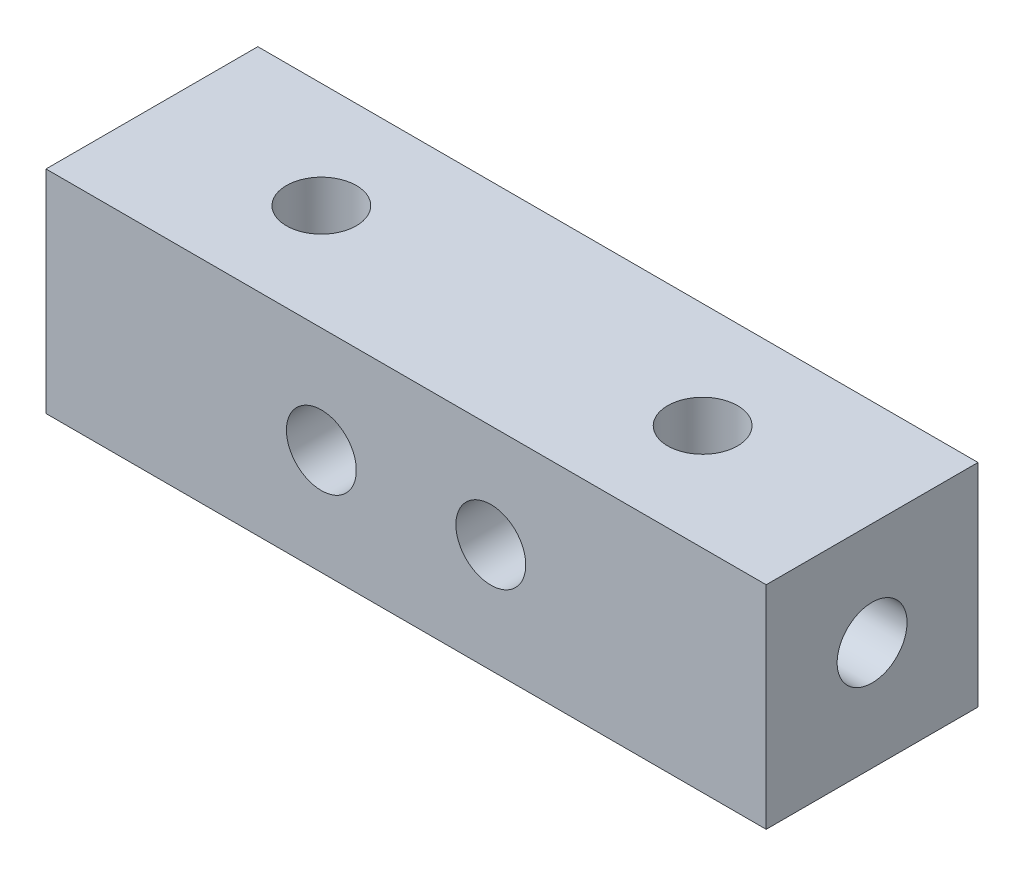
ISO-10303-21;
HEADER;
FILE_DESCRIPTION(('STEP AP214'),'2;1');
FILE_NAME('part.step','',(''),(''),'','','');
FILE_SCHEMA(('AUTOMOTIVE_DESIGN { 1 0 10303 214 1 1 1 1 }'));
ENDSEC;
DATA;
#1=APPLICATION_CONTEXT('core data for automotive mechanical design processes');
#2=APPLICATION_PROTOCOL_DEFINITION('international standard','automotive_design',2000,#1);
#3=PRODUCT_CONTEXT('',#1,'mechanical');
#4=PRODUCT('Part','Part','',(#3));
#5=PRODUCT_RELATED_PRODUCT_CATEGORY('part','',(#4));
#6=PRODUCT_DEFINITION_FORMATION('','',#4);
#7=PRODUCT_DEFINITION_CONTEXT('part definition',#1,'design');
#8=PRODUCT_DEFINITION('design','',#6,#7);
#9=PRODUCT_DEFINITION_SHAPE('','',#8);
#10=(LENGTH_UNIT() NAMED_UNIT(*) SI_UNIT(.MILLI.,.METRE.));
#11=(NAMED_UNIT(*) PLANE_ANGLE_UNIT() SI_UNIT($,.RADIAN.));
#12=(NAMED_UNIT(*) SI_UNIT($,.STERADIAN.) SOLID_ANGLE_UNIT());
#13=UNCERTAINTY_MEASURE_WITH_UNIT(LENGTH_MEASURE(1.E-05),#10,'distance_accuracy_value','');
#14=(GEOMETRIC_REPRESENTATION_CONTEXT(3) GLOBAL_UNCERTAINTY_ASSIGNED_CONTEXT((#13)) GLOBAL_UNIT_ASSIGNED_CONTEXT((#10,
#11,#12)) REPRESENTATION_CONTEXT('',''));
#15=CARTESIAN_POINT('',(0.,0.,0.));
#16=DIRECTION('',(0.,0.,1.));
#17=DIRECTION('',(1.,0.,0.));
#18=AXIS2_PLACEMENT_3D('',#15,#16,#17);
#19=CARTESIAN_POINT('',(17.,0.134296894459711,5.));
#20=DIRECTION('',(1.,0.,0.));
#21=DIRECTION('',(0.,0.,-1.));
#22=AXIS2_PLACEMENT_3D('',#19,#20,#21);
#23=CYLINDRICAL_SURFACE('',#22,1.65);
#24=CARTESIAN_POINT('',(9.00000000000001,0.134296894459711,5.));
#25=DIRECTION('',(0.707106781186547,0.707106781186547,0.));
#26=DIRECTION('',(0.707106781186547,-0.707106781186547,0.));
#27=AXIS2_PLACEMENT_3D('',#24,#25,#26);
#28=ELLIPSE('',#27,2.3334523779156,1.65);
#29=CARTESIAN_POINT('',(9.00000000000001,0.134296894459711,3.35));
#30=VERTEX_POINT('',#29);
#31=CARTESIAN_POINT('',(9.00000000000001,0.134296894459711,6.65));
#32=VERTEX_POINT('',#31);
#33=EDGE_CURVE('E141',#30,#32,#28,.T.);
#34=ORIENTED_EDGE('',*,*,#33,.T.);
#35=CARTESIAN_POINT('',(9.00000000000001,0.134296894459711,5.));
#36=DIRECTION('',(0.707106781186547,-0.707106781186547,0.));
#37=DIRECTION('',(0.707106781186547,0.707106781186547,0.));
#38=AXIS2_PLACEMENT_3D('',#35,#36,#37);
#39=ELLIPSE('',#38,2.3334523779156,1.65);
#40=EDGE_CURVE('E137',#32,#30,#39,.T.);
#41=ORIENTED_EDGE('',*,*,#40,.T.);
#42=EDGE_LOOP('',(#34,#41));
#43=FACE_BOUND('',#42,.T.);
#44=CARTESIAN_POINT('',(4.00000000000001,0.134296894459711,5.));
#45=DIRECTION('',(0.707106781186547,0.,0.707106781186547));
#46=DIRECTION('',(0.707106781186547,0.,-0.707106781186547));
#47=AXIS2_PLACEMENT_3D('',#44,#45,#46);
#48=ELLIPSE('',#47,2.3334523779156,1.65);
#49=CARTESIAN_POINT('',(4.00000000000001,1.78429689445971,5.));
#50=VERTEX_POINT('',#49);
#51=CARTESIAN_POINT('',(4.00000000000001,-1.51570310554028,5.));
#52=VERTEX_POINT('',#51);
#53=EDGE_CURVE('E59',#50,#52,#48,.F.);
#54=ORIENTED_EDGE('',*,*,#53,.T.);
#55=CARTESIAN_POINT('',(4.00000000000001,0.134296894459711,5.));
#56=DIRECTION('',(0.707106781186547,0.,-0.707106781186547));
#57=DIRECTION('',(0.707106781186547,0.,0.707106781186547));
#58=AXIS2_PLACEMENT_3D('',#55,#56,#57);
#59=ELLIPSE('',#58,2.3334523779156,1.65);
#60=EDGE_CURVE('E11',#52,#50,#59,.F.);
#61=ORIENTED_EDGE('',*,*,#60,.T.);
#62=EDGE_LOOP('',(#54,#61));
#63=FACE_BOUND('',#62,.T.);
#64=ADVANCED_FACE('F39',(#43,#63),#23,.F.);
#65=CARTESIAN_POINT('',(-5.64452556810116,0.134296894459711,3.35));
#66=CARTESIAN_POINT('',(-5.63838128300635,0.209553474713581,3.34999839990917));
#67=CARTESIAN_POINT('',(-5.62702957784832,0.284372493221433,3.35518794266545));
#68=CARTESIAN_POINT('',(-5.59460120311398,0.430536678441772,3.37513277728456));
#69=CARTESIAN_POINT('',(-5.5735182137332,0.501879554298802,3.38989428801288));
#70=CARTESIAN_POINT('',(-5.52312352893578,0.638651061992044,3.42738261235203));
#71=CARTESIAN_POINT('',(-5.49387376549181,0.704119487090391,3.45004978453406));
#72=CARTESIAN_POINT('',(-5.42850885262907,0.828747055599395,3.50173526103803));
#73=CARTESIAN_POINT('',(-5.39239191974611,0.887904553762668,3.53075521553024));
#74=CARTESIAN_POINT('',(-5.29743525106251,1.02409075553561,3.60742303689221));
#75=CARTESIAN_POINT('',(-5.23558230347391,1.09755793615206,3.65765457734761));
#76=CARTESIAN_POINT('',(-5.10283292496818,1.23092106916839,3.76419241031876));
#77=CARTESIAN_POINT('',(-5.03190859567463,1.29077350245006,3.82051735660913));
#78=CARTESIAN_POINT('',(-4.91877532240075,1.37133762860629,3.90736552748521));
#79=CARTESIAN_POINT('',(-4.8793597257372,1.39693624427059,3.93712683386715));
#80=CARTESIAN_POINT('',(-4.79847196497791,1.44469723292218,3.9966043625967));
#81=CARTESIAN_POINT('',(-4.75700045019747,1.46686068181839,4.02632059616213));
#82=CARTESIAN_POINT('',(-4.67193548442259,1.50772199471158,4.08486386236684));
#83=CARTESIAN_POINT('',(-4.62834684240008,1.52642728795923,4.11369268764112));
#84=CARTESIAN_POINT('',(-4.53864717746282,1.56033881216091,4.16936094289374));
#85=CARTESIAN_POINT('',(-4.4925391481768,1.57554908872966,4.19620264838331));
#86=CARTESIAN_POINT('',(-4.40436482139189,1.60023717474802,4.24230781753186));
#87=CARTESIAN_POINT('',(-4.36272870306332,1.61023250438028,4.26210412687908));
#88=CARTESIAN_POINT('',(-4.27695912181704,1.62717379178881,4.29700992796053));
#89=CARTESIAN_POINT('',(-4.23283204164422,1.63412717644369,4.31213080791551));
#90=CARTESIAN_POINT('',(-4.15035325607242,1.64356058762355,4.33311575664475));
#91=CARTESIAN_POINT('',(-4.11237906559687,1.64661804229242,4.34015131925974));
#92=CARTESIAN_POINT('',(-4.03569281320329,1.65005827436296,4.34808795746453));
#93=CARTESIAN_POINT('',(-3.99698201529201,1.65044528059273,4.34899873199483));
#94=CARTESIAN_POINT('',(-3.92006558964655,1.64851196302458,4.34451845579971));
#95=CARTESIAN_POINT('',(-3.88185942253961,1.64619481485897,4.33913479694843));
#96=CARTESIAN_POINT('',(-3.80678451789979,1.63908408186769,4.3231017881193));
#97=CARTESIAN_POINT('',(-3.76991901723732,1.63428488088951,4.31244049877558));
#98=CARTESIAN_POINT('',(-3.66907801012524,1.61781285217721,4.27730734099554));
#99=CARTESIAN_POINT('',(-3.60701927039166,1.6037128861853,4.24861134078378));
#100=CARTESIAN_POINT('',(-3.48757387903519,1.5696510415011,4.18540315060673));
#101=CARTESIAN_POINT('',(-3.43021184470437,1.54966052445117,4.15086290516764));
#102=CARTESIAN_POINT('',(-3.32418028987336,1.50623402718068,4.08251112350735));
#103=CARTESIAN_POINT('',(-3.27519014535316,1.48325657687882,4.0489033421607));
#104=CARTESIAN_POINT('',(-3.17998167989329,1.43282056765519,3.98111394426638));
#105=CARTESIAN_POINT('',(-3.13376534458885,1.40535884977585,3.94693193854404));
#106=CARTESIAN_POINT('',(-2.99922462644754,1.31625133939136,3.84519444198198));
#107=CARTESIAN_POINT('',(-2.91473241498692,1.24776965529226,3.77825555130815));
#108=CARTESIAN_POINT('',(-2.77960282747732,1.11334180103733,3.66986171366523));
#109=CARTESIAN_POINT('',(-2.72604376105199,1.05187357510263,3.62645973727763));
#110=CARTESIAN_POINT('',(-2.62701505302036,0.918837572531929,3.54638681988258));
#111=CARTESIAN_POINT('',(-2.58153182037528,0.847287134695607,3.50970456670675));
#112=CARTESIAN_POINT('',(-2.50885242335218,0.709770039813901,3.45218293732419));
#113=CARTESIAN_POINT('',(-2.47981868333233,0.645492209791653,3.42964538775561));
#114=CARTESIAN_POINT('',(-2.42974676037366,0.511752045929932,3.39225764047448));
#115=CARTESIAN_POINT('',(-2.408703779336,0.442292853346633,3.37740282767088));
#116=CARTESIAN_POINT('',(-2.37572927423904,0.299414205417291,3.35668780806618));
#117=CARTESIAN_POINT('',(-2.36385767262649,0.225972005295769,3.35088650674522));
#118=CARTESIAN_POINT('',(-2.35017674999692,0.0780513983567246,3.34930368810144));
#119=CARTESIAN_POINT('',(-2.34836338701865,0.00357341983678422,3.3535181449157));
#120=CARTESIAN_POINT('',(-2.35428229505021,-0.135906373600642,3.37091837065592));
#121=CARTESIAN_POINT('',(-2.36102958210719,-0.201080253765159,3.38311279961239));
#122=CARTESIAN_POINT('',(-2.38172513851613,-0.328403637483027,3.4148453491315));
#123=CARTESIAN_POINT('',(-2.39567466499334,-0.390552610976694,3.43438475157116));
#124=CARTESIAN_POINT('',(-2.43057044958172,-0.513487836906023,3.4809858188209));
#125=CARTESIAN_POINT('',(-2.45181952127202,-0.57406663823026,3.50836264521782));
#126=CARTESIAN_POINT('',(-2.49979731698566,-0.689800485456385,3.56904200837058));
#127=CARTESIAN_POINT('',(-2.52652852002612,-0.744953060866978,3.6023472250387));
#128=CARTESIAN_POINT('',(-2.59976020122485,-0.877639774460539,3.6931061442077));
#129=CARTESIAN_POINT('',(-2.64916693730055,-0.951282779924782,3.7539215814336));
#130=CARTESIAN_POINT('',(-2.7541194692126,-1.08515497468021,3.88454717322127));
#131=CARTESIAN_POINT('',(-2.80968426863899,-1.14534080860706,3.95438528791707));
#132=CARTESIAN_POINT('',(-2.92478062926497,-1.25410753416375,4.10356479101448));
#133=CARTESIAN_POINT('',(-2.98437781034922,-1.30234538267284,4.18310630444934));
#134=CARTESIAN_POINT('',(-3.07172246573277,-1.364583847358,4.30861010740562));
#135=CARTESIAN_POINT('',(-3.10047444638275,-1.38363298500285,4.35144177033364));
#136=CARTESIAN_POINT('',(-3.15623559104754,-1.41831992716761,4.43953260943586));
#137=CARTESIAN_POINT('',(-3.18324647174359,-1.43396112920884,4.48478931136303));
#138=CARTESIAN_POINT('',(-3.23058833147265,-1.45984149318032,4.5721895283323));
#139=CARTESIAN_POINT('',(-3.25133132526956,-1.47051813665163,4.61397580217617));
#140=CARTESIAN_POINT('',(-3.28841177360487,-1.48881452203586,4.70010082584544));
#141=CARTESIAN_POINT('',(-3.30475772358539,-1.49644017281568,4.74443444980001));
#142=CARTESIAN_POINT('',(-3.32817874370108,-1.50708143523673,4.82739369388802));
#143=CARTESIAN_POINT('',(-3.33639352695947,-1.51068009320347,4.86560863660857));
#144=CARTESIAN_POINT('',(-3.34670545692575,-1.51517048111676,4.942985077192));
#145=CARTESIAN_POINT('',(-3.34881528379509,-1.51606782192973,4.98214444251926));
#146=CARTESIAN_POINT('',(-3.3464903804651,-1.51506607281802,5.06024915433234));
#147=CARTESIAN_POINT('',(-3.34205065773861,-1.51316484963354,5.09919431481632));
#148=CARTESIAN_POINT('',(-3.32751950651226,-1.5067617126109,5.17582192535306));
#149=CARTESIAN_POINT('',(-3.31741445929286,-1.50225353115235,5.21350109991997));
#150=CARTESIAN_POINT('',(-3.28460130418803,-1.48701314876045,5.31283682939616));
#151=CARTESIAN_POINT('',(-3.25802124892339,-1.47413307346188,5.37283867658561));
#152=CARTESIAN_POINT('',(-3.19896164538047,-1.44290280753429,5.48841842318967));
#153=CARTESIAN_POINT('',(-3.16645421816148,-1.42452649248874,5.54397355119313));
#154=CARTESIAN_POINT('',(-3.10078370897037,-1.38395000655021,5.64835652390539));
#155=CARTESIAN_POINT('',(-3.06776705520366,-1.36203215149287,5.69738759988874));
#156=CARTESIAN_POINT('',(-3.00094142365237,-1.31380660886771,5.79268520496605));
#157=CARTESIAN_POINT('',(-2.96713186743552,-1.28749562505624,5.83894962251769));
#158=CARTESIAN_POINT('',(-2.86621323586449,-1.20198539644042,5.97374345905716));
#159=CARTESIAN_POINT('',(-2.79945398646079,-1.13611690445077,6.05850817568602));
#160=CARTESIAN_POINT('',(-2.689165811025,-1.00480690128834,6.1964835420186));
#161=CARTESIAN_POINT('',(-2.644013664369,-0.943413362530583,6.25227219159071));
#162=CARTESIAN_POINT('',(-2.56039448137544,-0.810059273861351,6.35564794677181));
#163=CARTESIAN_POINT('',(-2.52191550053183,-0.738118038764189,6.40324970505853));
#164=CARTESIAN_POINT('',(-2.46157626626661,-0.600156939023633,6.47916337164846));
#165=CARTESIAN_POINT('',(-2.43792446567618,-0.536003053104874,6.50942842544578));
#166=CARTESIAN_POINT('',(-2.39826634164588,-0.402246064347162,6.5619768251397));
#167=CARTESIAN_POINT('',(-2.38225551631101,-0.332646198368047,6.58426486897506));
#168=CARTESIAN_POINT('',(-2.35925700878858,-0.189138757971322,6.61968606862294));
#169=CARTESIAN_POINT('',(-2.35233262749127,-0.1152046730859,6.6327547090528));
#170=CARTESIAN_POINT('',(-2.34866657132563,0.0340029166350569,6.64865399531049));
#171=CARTESIAN_POINT('',(-2.35191988181534,0.109275743687316,6.65148968152584));
#172=CARTESIAN_POINT('',(-2.36768251377025,0.249972066889661,6.6472749960164));
#173=CARTESIAN_POINT('',(-2.37911551546665,0.315555281474567,6.64129521434702));
#174=CARTESIAN_POINT('',(-2.40944675543387,0.443831123916238,6.62200412965271));
#175=CARTESIAN_POINT('',(-2.42834615482981,0.506523300483539,6.60869168617338));
#176=CARTESIAN_POINT('',(-2.47356414062785,0.630071013145794,6.57510811631637));
#177=CARTESIAN_POINT('',(-2.50013994680897,0.690763365572574,6.55458921621741));
#178=CARTESIAN_POINT('',(-2.55925391338606,0.806846576312417,6.50801087243473));
#179=CARTESIAN_POINT('',(-2.59179486847562,0.862234931088744,6.48194883084833));
#180=CARTESIAN_POINT('',(-2.68033383908806,0.995136961604232,6.41058829048371));
#181=CARTESIAN_POINT('',(-2.73964768131743,1.06889941273062,6.36239680209518));
#182=CARTESIAN_POINT('',(-2.86720638871922,1.20329177075177,6.2597392876178));
#183=CARTESIAN_POINT('',(-2.93547719861855,1.26388211383197,6.20525509117932));
#184=CARTESIAN_POINT('',(-3.08132315224033,1.37371629671378,6.09209532673732));
#185=CARTESIAN_POINT('',(-3.15909194482601,1.42262946010994,6.03334811819637));
#186=CARTESIAN_POINT('',(-3.28167436584043,1.48613968534259,5.94673728367865));
#187=CARTESIAN_POINT('',(-3.32349387400474,1.50565688656314,5.91813701777934));
#188=CARTESIAN_POINT('',(-3.40941996421439,1.54138965955126,5.86236860896155));
#189=CARTESIAN_POINT('',(-3.45352465120952,1.55760791377465,5.8351993159143));
#190=CARTESIAN_POINT('',(-3.5399857440224,1.58516169553303,5.78625736236287));
#191=CARTESIAN_POINT('',(-3.58208438935481,1.59682131461742,5.76421672612697));
#192=CARTESIAN_POINT('',(-3.66889859208992,1.61705072954628,5.72418375872288));
#193=CARTESIAN_POINT('',(-3.71361069571534,1.62562450073308,5.70618623034403));
#194=CARTESIAN_POINT('',(-3.79752508092772,1.63797517423097,5.67943508152688));
#195=CARTESIAN_POINT('',(-3.83628338285748,1.64233561093466,5.66960409766316));
#196=CARTESIAN_POINT('',(-3.91502490083092,1.64828020911548,5.6560590647205));
#197=CARTESIAN_POINT('',(-3.95500457087722,1.64987175057157,5.65232875701401));
#198=CARTESIAN_POINT('',(-4.03516521899143,1.65011361042592,5.65176676775465));
#199=CARTESIAN_POINT('',(-4.07534641324297,1.64875366648876,5.6549591564337));
#200=CARTESIAN_POINT('',(-4.15454923664186,1.64322871976799,5.66758436738649));
#201=CARTESIAN_POINT('',(-4.19356768770775,1.63905665520677,5.67703289898471));
#202=CARTESIAN_POINT('',(-4.29162450626099,1.62515569921755,5.70727741314944));
#203=CARTESIAN_POINT('',(-4.34931361794311,1.61361224948476,5.73147346226844));
#204=CARTESIAN_POINT('',(-4.46055287847674,1.58546831211744,5.78584237342844));
#205=CARTESIAN_POINT('',(-4.51408235127512,1.56884436576921,5.81604272882963));
#206=CARTESIAN_POINT('',(-4.616251285498,1.53153446300247,5.87835814042833));
#207=CARTESIAN_POINT('',(-4.6649862339477,1.51097669726052,5.91039488004471));
#208=CARTESIAN_POINT('',(-4.75972617520316,1.46563119605508,5.97551594033974));
#209=CARTESIAN_POINT('',(-4.80572894070145,1.44084007160982,6.00860108289082));
#210=CARTESIAN_POINT('',(-4.93990205070697,1.36014286238906,6.10771363749673));
#211=CARTESIAN_POINT('',(-5.02441748144579,1.29784624428416,6.17371833633714));
#212=CARTESIAN_POINT('',(-5.16556483289386,1.17085989569207,6.28593615299632));
#213=CARTESIAN_POINT('',(-5.22428983090947,1.10954754214694,6.33335832440564));
#214=CARTESIAN_POINT('',(-5.3333702581807,0.975728208551369,6.42157665931061));
#215=CARTESIAN_POINT('',(-5.38374176281726,0.903243260297142,6.46238554581047));
#216=CARTESIAN_POINT('',(-5.46379453086982,0.764668927783064,6.52630374473711));
#217=CARTESIAN_POINT('',(-5.49558893114972,0.700693325912971,6.5513316776765));
#218=CARTESIAN_POINT('',(-5.55121799403688,0.566968921795664,6.59380142422053));
#219=CARTESIAN_POINT('',(-5.57505720534504,0.49722344727666,6.61124757474701));
#220=CARTESIAN_POINT('',(-5.61353666116552,0.352993794387192,6.63709267150789));
#221=CARTESIAN_POINT('',(-5.62810682296174,0.27847809576113,6.64542302636713));
#222=CARTESIAN_POINT('',(-5.64679816918708,0.12772050821278,6.6517067757695));
#223=CARTESIAN_POINT('',(-5.65092571270195,0.0514796983618789,6.64966648784764));
#224=CARTESIAN_POINT('',(-5.64885261701877,-0.0907369592028171,6.63595472037107));
#225=CARTESIAN_POINT('',(-5.64382668447914,-0.156851216253723,6.62546268792032));
#226=CARTESIAN_POINT('',(-5.62627510106161,-0.286357891233377,6.59685583094737));
#227=CARTESIAN_POINT('',(-5.6137484464573,-0.349749943667083,6.57873998632361));
#228=CARTESIAN_POINT('',(-5.58176189905383,-0.474092707111983,6.53519416147454));
#229=CARTESIAN_POINT('',(-5.56212566838095,-0.53493290268475,6.50958165591451));
#230=CARTESIAN_POINT('',(-5.51723719334115,-0.651458421057872,6.45234648792429));
#231=CARTESIAN_POINT('',(-5.49198227782276,-0.707141274139159,6.4207209679195));
#232=CARTESIAN_POINT('',(-5.42288358492491,-0.84027512234567,6.33484816871701));
#233=CARTESIAN_POINT('',(-5.37616943724778,-0.914145920784924,6.27734480670812));
#234=CARTESIAN_POINT('',(-5.27631302172516,-1.0491006193946,6.15347582453889));
#235=CARTESIAN_POINT('',(-5.22315332080414,-1.11014856382065,6.08708611706136));
#236=CARTESIAN_POINT('',(-5.11239555519197,-1.22120586197673,5.94522167964659));
#237=CARTESIAN_POINT('',(-5.05471947102398,-1.27089882628158,5.86956039140384));
#238=CARTESIAN_POINT('',(-4.96914002708098,-1.33587335248356,5.75042180032094));
#239=CARTESIAN_POINT('',(-4.94078560301571,-1.35592845417008,5.70979318362882));
#240=CARTESIAN_POINT('',(-4.88518545871875,-1.39285849439594,5.62640047080426));
#241=CARTESIAN_POINT('',(-4.85793903732165,-1.40973546946478,5.58363776456655));
#242=CARTESIAN_POINT('',(-4.8071932035162,-1.43935867975601,5.4980407955409));
#243=CARTESIAN_POINT('',(-4.78356967009939,-1.45228246101621,5.45534281270001));
#244=CARTESIAN_POINT('',(-4.7400049490541,-1.47495521007604,5.36725142603367));
#245=CARTESIAN_POINT('',(-4.72006151552508,-1.48470611701793,5.32185968866528));
#246=CARTESIAN_POINT('',(-4.6893886665861,-1.49916037239766,5.23632768268126));
#247=CARTESIAN_POINT('',(-4.67765716324268,-1.50444871669938,5.1966604495345));
#248=CARTESIAN_POINT('',(-4.66033925799955,-1.51213304849541,5.11578417351953));
#249=CARTESIAN_POINT('',(-4.65473300956026,-1.51453837976089,5.07458056018414));
#250=CARTESIAN_POINT('',(-4.65086362678231,-1.51620698374406,4.99145872009578));
#251=CARTESIAN_POINT('',(-4.65265038063433,-1.51544890941717,4.94953754562066));
#252=CARTESIAN_POINT('',(-4.6632460414625,-1.51083868154344,4.86673237735752));
#253=CARTESIAN_POINT('',(-4.67207266189851,-1.50697872296109,4.82585126864083));
#254=CARTESIAN_POINT('',(-4.70009467775237,-1.49421789389055,4.72828214604137));
#255=CARTESIAN_POINT('',(-4.72215572462087,-1.48383854480107,4.6726509456523));
#256=CARTESIAN_POINT('',(-4.77231166610288,-1.45836594349229,4.56526336825963));
#257=CARTESIAN_POINT('',(-4.80043366831356,-1.44325137053192,4.51352585628292));
#258=CARTESIAN_POINT('',(-4.85942564890861,-1.40891745981501,4.41370158339413));
#259=CARTESIAN_POINT('',(-4.89027270158794,-1.3897307597708,4.36558969052742));
#260=CARTESIAN_POINT('',(-4.95324658139065,-1.34731813623702,4.27201827638012));
#261=CARTESIAN_POINT('',(-4.98537446933018,-1.32408880862848,4.22656103389622));
#262=CARTESIAN_POINT('',(-5.04979731695746,-1.27361706372323,4.1381022255138));
#263=CARTESIAN_POINT('',(-5.08209216802426,-1.24637699984228,4.09509923990416));
#264=CARTESIAN_POINT('',(-5.14607867525386,-1.18780760624807,4.01149405560197));
#265=CARTESIAN_POINT('',(-5.17777023329157,-1.15647761771475,3.97089224523387));
#266=CARTESIAN_POINT('',(-5.26035692895379,-1.06758155636809,3.86627529601406));
#267=CARTESIAN_POINT('',(-5.31015412417566,-1.00632529227836,3.80445010933562));
#268=CARTESIAN_POINT('',(-5.40314484276335,-0.871974143531864,3.68938756588008));
#269=CARTESIAN_POINT('',(-5.44635192240138,-0.798904216438806,3.63613256691111));
#270=CARTESIAN_POINT('',(-5.51388200412823,-0.659669471243714,3.55186454563906));
#271=CARTESIAN_POINT('',(-5.54025767389129,-0.595897158683852,3.51856365045161));
#272=CARTESIAN_POINT('',(-5.58548761318726,-0.46226937465488,3.45989583847778));
#273=CARTESIAN_POINT('',(-5.60434616170383,-0.39241739159767,3.43452440976903));
#274=CARTESIAN_POINT('',(-5.63302597188391,-0.247443512697395,3.39298281684956));
#275=CARTESIAN_POINT('',(-5.64276023612035,-0.172278091584125,3.37690177855034));
#276=CARTESIAN_POINT('',(-5.65164366269606,-0.0198233522788868,3.35541403964936));
#277=CARTESIAN_POINT('',(-5.65079848457496,0.0574648082606126,3.35000163358894));
#278=CARTESIAN_POINT('',(-5.64452556810116,0.134296894459711,3.35));
#279=B_SPLINE_CURVE_WITH_KNOTS('',3,(#65,#66,#67,#68,#69,#70,#71,#72,#73,#74,#75,#76,#77,#78,
#79,#80,#81,#82,#83,#84,#85,#86,#87,#88,#89,#90,#91,#92,#93,#94,#95,#96,#97,#98,#99,#100,#101,
#102,#103,#104,#105,#106,#107,#108,#109,#110,#111,#112,#113,#114,#115,#116,#117,#118,#119,#120,
#121,#122,#123,#124,#125,#126,#127,#128,#129,#130,#131,#132,#133,#134,#135,#136,#137,#138,#139,
#140,#141,#142,#143,#144,#145,#146,#147,#148,#149,#150,#151,#152,#153,#154,#155,#156,#157,#158,
#159,#160,#161,#162,#163,#164,#165,#166,#167,#168,#169,#170,#171,#172,#173,#174,#175,#176,#177,
#178,#179,#180,#181,#182,#183,#184,#185,#186,#187,#188,#189,#190,#191,#192,#193,#194,#195,#196,
#197,#198,#199,#200,#201,#202,#203,#204,#205,#206,#207,#208,#209,#210,#211,#212,#213,#214,#215,
#216,#217,#218,#219,#220,#221,#222,#223,#224,#225,#226,#227,#228,#229,#230,#231,#232,#233,#234,
#235,#236,#237,#238,#239,#240,#241,#242,#243,#244,#245,#246,#247,#248,#249,#250,#251,#252,#253,
#254,#255,#256,#257,#258,#259,#260,#261,#262,#263,#264,#265,#266,#267,#268,#269,#270,#271,#272,
#273,#274,#275,#276,#277,#278),.UNSPECIFIED.,.T.,.F.,(4,2,2,2,2,2,2,2,2,2,2,2,2,2,2,2,2,2,2,2,2,
2,2,2,2,2,2,2,2,2,2,2,2,2,2,2,2,2,2,2,2,2,2,2,2,2,2,2,2,2,2,2,2,2,2,2,2,2,2,2,2,2,2,2,2,2,2,2,2,
2,2,2,2,2,2,2,2,2,2,2,2,2,2,2,2,2,2,2,2,2,2,2,2,2,2,2,2,2,2,2,2,2,2,2,2,2,4),(0.,
0.226173631990209,0.452494355422708,0.677143351832728,0.901850771448142,1.22524490314337,
1.54965866585114,1.71643168682471,1.88315236776025,2.04951060685879,2.21567529884885,
2.35693212628674,2.49784212523677,2.61356539184351,2.72910536101918,2.84450978188821,
2.96017647879838,3.16841589337985,3.37768490580375,3.56852254399173,3.75949520301431,
4.14038737669518,4.41657451054248,4.69229234273462,4.91354727854745,5.13466914964678,
5.35722381041102,5.5796890298176,5.77873022926606,5.97780618239827,6.18640648251661,
6.39510132040682,6.71589777815258,7.03771332229487,7.36790980599298,7.53275793750741,
7.6974409649429,7.8407701557794,7.98382040101094,8.10109777753657,8.21813139027707,
8.33525426037465,8.45265989365932,8.6521517554754,8.8526073211187,9.04147976892427,
9.23049457325823,9.60763772520237,9.89005598866259,10.1719634050739,10.3954086921719,
10.618722167181,10.8435832429773,11.0683335451145,11.2679379924941,11.4675734932728,
11.674881397291,11.8822866751904,12.1991563366526,12.5169649879615,12.8429204805367,
13.0056838703336,13.1683143794064,13.3148778016679,13.461251732082,13.581457986151,
13.7013433589806,13.8216462417258,13.9422523593406,14.132013510498,14.3226644542076,
14.5079229549095,14.6933304641407,15.0634725764561,15.3542475399513,15.6444562772335,
15.8706766217067,16.096767393023,16.3245479185852,16.55218970261,16.752642154335,
16.9531214360634,17.1589583326586,17.3648932950679,17.6770137186976,17.9899979881762,
18.3108572429048,18.4710999286021,18.631239579454,18.7824719335693,18.9336116857566,
19.058274710065,19.1825326026762,19.3076303538167,19.433043868235,19.614238377137,
19.7962607478426,19.9768758867154,20.1576438561151,20.3383061742981,20.5189976302227,
20.8186851125992,21.1177475546549,21.3467496226183,21.5756211485517,21.8066533407394,
22.0375619460788),.UNSPECIFIED.);
#280=CARTESIAN_POINT('',(-5.64452556810116,0.134296894459711,3.35));
#281=VERTEX_POINT('',#280);
#282=EDGE_CURVE('E43',#281,#281,#279,.T.);
#283=ORIENTED_EDGE('',*,*,#282,.T.);
#284=EDGE_LOOP('',(#283));
#285=FACE_BOUND('',#284,.T.);
#286=CARTESIAN_POINT('',(4.00000000000001,0.134296894459711,5.));
#287=DIRECTION('',(0.707106781186547,0.,0.707106781186547));
#288=DIRECTION('',(0.707106781186547,0.,-0.707106781186547));
#289=AXIS2_PLACEMENT_3D('',#286,#287,#288);
#290=ELLIPSE('',#289,2.3334523779156,1.65);
#291=EDGE_CURVE('E106',#50,#52,#290,.T.);
#292=ORIENTED_EDGE('',*,*,#291,.T.);
#293=CARTESIAN_POINT('',(4.00000000000001,0.134296894459711,5.));
#294=DIRECTION('',(0.707106781186547,0.,-0.707106781186547));
#295=DIRECTION('',(0.707106781186547,0.,0.707106781186547));
#296=AXIS2_PLACEMENT_3D('',#293,#294,#295);
#297=ELLIPSE('',#296,2.3334523779156,1.65);
#298=EDGE_CURVE('E54',#52,#50,#297,.T.);
#299=ORIENTED_EDGE('',*,*,#298,.T.);
#300=EDGE_LOOP('',(#292,#299));
#301=FACE_BOUND('',#300,.T.);
#302=CARTESIAN_POINT('',(-8.99999999999999,0.134296894459711,5.));
#303=DIRECTION('',(0.707106781186547,0.707106781186547,0.));
#304=DIRECTION('',(0.707106781186547,-0.707106781186547,0.));
#305=AXIS2_PLACEMENT_3D('',#302,#303,#304);
#306=ELLIPSE('',#305,2.3334523779156,1.65);
#307=CARTESIAN_POINT('',(-8.99999999999999,0.134296894459711,3.35));
#308=VERTEX_POINT('',#307);
#309=CARTESIAN_POINT('',(-8.99999999999999,0.134296894459711,6.65));
#310=VERTEX_POINT('',#309);
#311=EDGE_CURVE('E66',#308,#310,#306,.F.);
#312=ORIENTED_EDGE('',*,*,#311,.T.);
#313=CARTESIAN_POINT('',(-8.99999999999999,0.134296894459711,5.));
#314=DIRECTION('',(0.707106781186547,-0.707106781186547,0.));
#315=DIRECTION('',(0.707106781186547,0.707106781186547,0.));
#316=AXIS2_PLACEMENT_3D('',#313,#314,#315);
#317=ELLIPSE('',#316,2.3334523779156,1.65);
#318=EDGE_CURVE('E115',#310,#308,#317,.F.);
#319=ORIENTED_EDGE('',*,*,#318,.T.);
#320=EDGE_LOOP('',(#312,#319));
#321=FACE_BOUND('',#320,.T.);
#322=ADVANCED_FACE('F117',(#285,#301,#321),#23,.F.);
#323=CARTESIAN_POINT('',(17.,0.134296894459711,5.));
#324=DIRECTION('',(1.,0.,0.));
#325=DIRECTION('',(0.,0.,-1.));
#326=AXIS2_PLACEMENT_3D('',#323,#324,#325);
#327=CIRCLE('',#326,1.65);
#328=CARTESIAN_POINT('',(17.,0.134296894459711,3.35));
#329=VERTEX_POINT('',#328);
#330=EDGE_CURVE('E194',#329,#329,#327,.T.);
#331=ORIENTED_EDGE('',*,*,#330,.T.);
#332=EDGE_LOOP('',(#331));
#333=FACE_BOUND('',#332,.T.);
#334=CARTESIAN_POINT('',(9.00000000000001,0.134296894459711,5.));
#335=DIRECTION('',(0.707106781186547,0.707106781186547,0.));
#336=DIRECTION('',(0.707106781186547,-0.707106781186547,0.));
#337=AXIS2_PLACEMENT_3D('',#334,#335,#336);
#338=ELLIPSE('',#337,2.3334523779156,1.65);
#339=EDGE_CURVE('E145',#30,#32,#338,.F.);
#340=ORIENTED_EDGE('',*,*,#339,.T.);
#341=CARTESIAN_POINT('',(9.00000000000001,0.134296894459711,5.));
#342=DIRECTION('',(0.707106781186547,-0.707106781186547,0.));
#343=DIRECTION('',(0.707106781186547,0.707106781186547,0.));
#344=AXIS2_PLACEMENT_3D('',#341,#342,#343);
#345=ELLIPSE('',#344,2.3334523779156,1.65);
#346=EDGE_CURVE('E133',#32,#30,#345,.F.);
#347=ORIENTED_EDGE('',*,*,#346,.T.);
#348=EDGE_LOOP('',(#340,#347));
#349=FACE_BOUND('',#348,.T.);
#350=ADVANCED_FACE('F274',(#333,#349),#23,.F.);
#351=CARTESIAN_POINT('',(-17.,-5.,10.));
#352=DIRECTION('',(1.,0.,0.));
#353=DIRECTION('',(0.,0.,-1.));
#354=AXIS2_PLACEMENT_3D('',#351,#352,#353);
#355=PLANE('',#354);
#356=CARTESIAN_POINT('',(-17.,0.134296894459711,5.));
#357=DIRECTION('',(1.,0.,0.));
#358=DIRECTION('',(0.,0.,-1.));
#359=AXIS2_PLACEMENT_3D('',#356,#357,#358);
#360=CIRCLE('',#359,1.65);
#361=CARTESIAN_POINT('',(-17.,0.134296894459711,3.35));
#362=VERTEX_POINT('',#361);
#363=EDGE_CURVE('E179',#362,#362,#360,.T.);
#364=ORIENTED_EDGE('',*,*,#363,.T.);
#365=EDGE_LOOP('',(#364));
#366=FACE_BOUND('',#365,.T.);
#367=DIRECTION('',(0.,-1.,0.));
#368=VECTOR('',#367,1.);
#369=CARTESIAN_POINT('',(-17.,-5.,0.));
#370=LINE('',#369,#368);
#371=CARTESIAN_POINT('',(-17.,5.,0.));
#372=VERTEX_POINT('',#371);
#373=CARTESIAN_POINT('',(-17.,-5.,0.));
#374=VERTEX_POINT('',#373);
#375=EDGE_CURVE('E175',#372,#374,#370,.T.);
#376=ORIENTED_EDGE('',*,*,#375,.T.);
#377=DIRECTION('',(0.,0.,-1.));
#378=VECTOR('',#377,1.);
#379=CARTESIAN_POINT('',(-17.,-5.,10.));
#380=LINE('',#379,#378);
#381=CARTESIAN_POINT('',(-17.,-5.,10.));
#382=VERTEX_POINT('',#381);
#383=EDGE_CURVE('E148',#382,#374,#380,.T.);
#384=ORIENTED_EDGE('',*,*,#383,.F.);
#385=DIRECTION('',(0.,-1.,0.));
#386=VECTOR('',#385,1.);
#387=CARTESIAN_POINT('',(-17.,-5.,10.));
#388=LINE('',#387,#386);
#389=CARTESIAN_POINT('',(-17.,5.,10.));
#390=VERTEX_POINT('',#389);
#391=EDGE_CURVE('E168',#390,#382,#388,.T.);
#392=ORIENTED_EDGE('',*,*,#391,.F.);
#393=DIRECTION('',(0.,0.,-1.));
#394=VECTOR('',#393,1.);
#395=CARTESIAN_POINT('',(-17.,5.,10.));
#396=LINE('',#395,#394);
#397=EDGE_CURVE('E160',#390,#372,#396,.T.);
#398=ORIENTED_EDGE('',*,*,#397,.T.);
#399=EDGE_LOOP('',(#376,#384,#392,#398));
#400=FACE_BOUND('',#399,.T.);
#401=ADVANCED_FACE('F41',(#366,#400),#355,.F.);
#402=CARTESIAN_POINT('',(17.,-5.,10.));
#403=DIRECTION('',(0.,1.,0.));
#404=DIRECTION('',(-1.,0.,0.));
#405=AXIS2_PLACEMENT_3D('',#402,#403,#404);
#406=PLANE('',#405);
#407=CARTESIAN_POINT('',(-8.99999999999999,-5.,5.));
#408=DIRECTION('',(0.,-1.,0.));
#409=DIRECTION('',(0.,0.,-1.));
#410=AXIS2_PLACEMENT_3D('',#407,#408,#409);
#411=CIRCLE('',#410,1.64999999999999);
#412=CARTESIAN_POINT('',(-8.99999999999999,-5.,3.35000000000001));
#413=VERTEX_POINT('',#412);
#414=EDGE_CURVE('E210',#413,#413,#411,.T.);
#415=ORIENTED_EDGE('',*,*,#414,.F.);
#416=EDGE_LOOP('',(#415));
#417=FACE_BOUND('',#416,.T.);
#418=CARTESIAN_POINT('',(9.00000000000001,-5.,5.));
#419=DIRECTION('',(0.,-1.,0.));
#420=DIRECTION('',(0.,0.,-1.));
#421=AXIS2_PLACEMENT_3D('',#418,#419,#420);
#422=CIRCLE('',#421,1.64999999999999);
#423=CARTESIAN_POINT('',(9.00000000000001,-5.,3.35000000000001));
#424=VERTEX_POINT('',#423);
#425=EDGE_CURVE('E202',#424,#424,#422,.T.);
#426=ORIENTED_EDGE('',*,*,#425,.F.);
#427=EDGE_LOOP('',(#426));
#428=FACE_BOUND('',#427,.T.);
#429=DIRECTION('',(1.,0.,0.));
#430=VECTOR('',#429,1.);
#431=CARTESIAN_POINT('',(17.,-5.,0.));
#432=LINE('',#431,#430);
#433=CARTESIAN_POINT('',(17.,-5.,0.));
#434=VERTEX_POINT('',#433);
#435=EDGE_CURVE('E172',#374,#434,#432,.T.);
#436=ORIENTED_EDGE('',*,*,#435,.T.);
#437=DIRECTION('',(0.,0.,-1.));
#438=VECTOR('',#437,1.);
#439=CARTESIAN_POINT('',(17.,-5.,10.));
#440=LINE('',#439,#438);
#441=CARTESIAN_POINT('',(17.,-5.,10.));
#442=VERTEX_POINT('',#441);
#443=EDGE_CURVE('E152',#442,#434,#440,.T.);
#444=ORIENTED_EDGE('',*,*,#443,.F.);
#445=DIRECTION('',(1.,0.,0.));
#446=VECTOR('',#445,1.);
#447=CARTESIAN_POINT('',(17.,-5.,10.));
#448=LINE('',#447,#446);
#449=EDGE_CURVE('E185',#382,#442,#448,.T.);
#450=ORIENTED_EDGE('',*,*,#449,.F.);
#451=ORIENTED_EDGE('',*,*,#383,.T.);
#452=EDGE_LOOP('',(#436,#444,#450,#451));
#453=FACE_BOUND('',#452,.T.);
#454=ADVANCED_FACE('F258',(#417,#428,#453),#406,.F.);
#455=CARTESIAN_POINT('',(17.,-5.,10.));
#456=DIRECTION('',(-1.,0.,0.));
#457=DIRECTION('',(0.,0.,1.));
#458=AXIS2_PLACEMENT_3D('',#455,#456,#457);
#459=PLANE('',#458);
#460=ORIENTED_EDGE('',*,*,#330,.F.);
#461=EDGE_LOOP('',(#460));
#462=FACE_BOUND('',#461,.T.);
#463=DIRECTION('',(0.,1.,0.));
#464=VECTOR('',#463,1.);
#465=CARTESIAN_POINT('',(17.,-5.,0.));
#466=LINE('',#465,#464);
#467=CARTESIAN_POINT('',(17.,5.,0.));
#468=VERTEX_POINT('',#467);
#469=EDGE_CURVE('E169',#434,#468,#466,.T.);
#470=ORIENTED_EDGE('',*,*,#469,.T.);
#471=DIRECTION('',(0.,0.,-1.));
#472=VECTOR('',#471,1.);
#473=CARTESIAN_POINT('',(17.,5.,10.));
#474=LINE('',#473,#472);
#475=CARTESIAN_POINT('',(17.,5.,10.));
#476=VERTEX_POINT('',#475);
#477=EDGE_CURVE('E156',#476,#468,#474,.T.);
#478=ORIENTED_EDGE('',*,*,#477,.F.);
#479=DIRECTION('',(0.,1.,0.));
#480=VECTOR('',#479,1.);
#481=CARTESIAN_POINT('',(17.,-5.,10.));
#482=LINE('',#481,#480);
#483=EDGE_CURVE('E182',#442,#476,#482,.T.);
#484=ORIENTED_EDGE('',*,*,#483,.F.);
#485=ORIENTED_EDGE('',*,*,#443,.T.);
#486=EDGE_LOOP('',(#470,#478,#484,#485));
#487=FACE_BOUND('',#486,.T.);
#488=ADVANCED_FACE('F255',(#462,#487),#459,.F.);
#489=CARTESIAN_POINT('',(17.,5.,10.));
#490=DIRECTION('',(0.,-1.,0.));
#491=DIRECTION('',(1.,0.,0.));
#492=AXIS2_PLACEMENT_3D('',#489,#490,#491);
#493=PLANE('',#492);
#494=CARTESIAN_POINT('',(-8.99999999999999,5.00000000000001,5.));
#495=DIRECTION('',(0.,-1.,0.));
#496=DIRECTION('',(0.,0.,-1.));
#497=AXIS2_PLACEMENT_3D('',#494,#495,#496);
#498=CIRCLE('',#497,1.65);
#499=CARTESIAN_POINT('',(-8.99999999999999,5.00000000000001,3.35));
#500=VERTEX_POINT('',#499);
#501=EDGE_CURVE('E206',#500,#500,#498,.T.);
#502=ORIENTED_EDGE('',*,*,#501,.T.);
#503=EDGE_LOOP('',(#502));
#504=FACE_BOUND('',#503,.T.);
#505=CARTESIAN_POINT('',(9.00000000000001,5.00000000000001,5.));
#506=DIRECTION('',(0.,-1.,0.));
#507=DIRECTION('',(0.,0.,-1.));
#508=AXIS2_PLACEMENT_3D('',#505,#506,#507);
#509=CIRCLE('',#508,1.65);
#510=CARTESIAN_POINT('',(9.00000000000001,5.00000000000001,3.35));
#511=VERTEX_POINT('',#510);
#512=EDGE_CURVE('E198',#511,#511,#509,.T.);
#513=ORIENTED_EDGE('',*,*,#512,.T.);
#514=EDGE_LOOP('',(#513));
#515=FACE_BOUND('',#514,.T.);
#516=DIRECTION('',(-1.,0.,0.));
#517=VECTOR('',#516,1.);
#518=CARTESIAN_POINT('',(17.,5.,0.));
#519=LINE('',#518,#517);
#520=EDGE_CURVE('E165',#468,#372,#519,.T.);
#521=ORIENTED_EDGE('',*,*,#520,.T.);
#522=ORIENTED_EDGE('',*,*,#397,.F.);
#523=DIRECTION('',(-1.,0.,0.));
#524=VECTOR('',#523,1.);
#525=CARTESIAN_POINT('',(17.,5.,10.));
#526=LINE('',#525,#524);
#527=EDGE_CURVE('E164',#476,#390,#526,.T.);
#528=ORIENTED_EDGE('',*,*,#527,.F.);
#529=ORIENTED_EDGE('',*,*,#477,.T.);
#530=EDGE_LOOP('',(#521,#522,#528,#529));
#531=FACE_BOUND('',#530,.T.);
#532=ADVANCED_FACE('F251',(#504,#515,#531),#493,.F.);
#533=CARTESIAN_POINT('',(0.,0.,10.));
#534=DIRECTION('',(0.,0.,1.));
#535=DIRECTION('',(1.,0.,0.));
#536=AXIS2_PLACEMENT_3D('',#533,#534,#535);
#537=PLANE('',#536);
#538=CARTESIAN_POINT('',(-3.99999999999999,0.,10.));
#539=DIRECTION('',(0.,0.,-1.));
#540=DIRECTION('',(-1.,0.,0.));
#541=AXIS2_PLACEMENT_3D('',#538,#539,#540);
#542=CIRCLE('',#541,1.65);
#543=CARTESIAN_POINT('',(-5.64999999999999,0.,10.));
#544=VERTEX_POINT('',#543);
#545=EDGE_CURVE('E222',#544,#544,#542,.T.);
#546=ORIENTED_EDGE('',*,*,#545,.T.);
#547=EDGE_LOOP('',(#546));
#548=FACE_BOUND('',#547,.T.);
#549=CARTESIAN_POINT('',(4.00000000000001,0.13429689445971,10.));
#550=DIRECTION('',(0.,0.,-1.));
#551=DIRECTION('',(-1.,0.,0.));
#552=AXIS2_PLACEMENT_3D('',#549,#550,#551);
#553=CIRCLE('',#552,1.65);
#554=CARTESIAN_POINT('',(2.35000000000001,0.13429689445971,10.));
#555=VERTEX_POINT('',#554);
#556=EDGE_CURVE('E214',#555,#555,#553,.T.);
#557=ORIENTED_EDGE('',*,*,#556,.T.);
#558=EDGE_LOOP('',(#557));
#559=FACE_BOUND('',#558,.T.);
#560=ORIENTED_EDGE('',*,*,#391,.T.);
#561=ORIENTED_EDGE('',*,*,#449,.T.);
#562=ORIENTED_EDGE('',*,*,#483,.T.);
#563=ORIENTED_EDGE('',*,*,#527,.T.);
#564=EDGE_LOOP('',(#560,#561,#562,#563));
#565=FACE_BOUND('',#564,.T.);
#566=ADVANCED_FACE('F238',(#548,#559,#565),#537,.T.);
#567=CARTESIAN_POINT('',(0.,0.,0.));
#568=DIRECTION('',(0.,0.,1.));
#569=DIRECTION('',(1.,0.,0.));
#570=AXIS2_PLACEMENT_3D('',#567,#568,#569);
#571=PLANE('',#570);
#572=CARTESIAN_POINT('',(-3.99999999999999,0.,0.));
#573=DIRECTION('',(0.,0.,-1.));
#574=DIRECTION('',(-1.,0.,0.));
#575=AXIS2_PLACEMENT_3D('',#572,#573,#574);
#576=CIRCLE('',#575,1.64999999999999);
#577=CARTESIAN_POINT('',(-5.64999999999998,0.,0.));
#578=VERTEX_POINT('',#577);
#579=EDGE_CURVE('E226',#578,#578,#576,.T.);
#580=ORIENTED_EDGE('',*,*,#579,.F.);
#581=EDGE_LOOP('',(#580));
#582=FACE_BOUND('',#581,.T.);
#583=CARTESIAN_POINT('',(4.00000000000001,0.13429689445971,0.));
#584=DIRECTION('',(0.,0.,-1.));
#585=DIRECTION('',(-1.,0.,0.));
#586=AXIS2_PLACEMENT_3D('',#583,#584,#585);
#587=CIRCLE('',#586,1.64999999999999);
#588=CARTESIAN_POINT('',(2.35000000000002,0.13429689445971,0.));
#589=VERTEX_POINT('',#588);
#590=EDGE_CURVE('E218',#589,#589,#587,.T.);
#591=ORIENTED_EDGE('',*,*,#590,.F.);
#592=EDGE_LOOP('',(#591));
#593=FACE_BOUND('',#592,.T.);
#594=ORIENTED_EDGE('',*,*,#375,.F.);
#595=ORIENTED_EDGE('',*,*,#520,.F.);
#596=ORIENTED_EDGE('',*,*,#469,.F.);
#597=ORIENTED_EDGE('',*,*,#435,.F.);
#598=EDGE_LOOP('',(#594,#595,#596,#597));
#599=FACE_BOUND('',#598,.T.);
#600=ADVANCED_FACE('F234',(#582,#593,#599),#571,.F.);
#601=CARTESIAN_POINT('',(-8.99999999999999,0.134296894459711,5.));
#602=DIRECTION('',(0.707106781186547,0.707106781186547,0.));
#603=DIRECTION('',(0.707106781186547,-0.707106781186547,0.));
#604=AXIS2_PLACEMENT_3D('',#601,#602,#603);
#605=ELLIPSE('',#604,2.3334523779156,1.65);
#606=EDGE_CURVE('E127',#308,#310,#605,.T.);
#607=ORIENTED_EDGE('',*,*,#606,.T.);
#608=CARTESIAN_POINT('',(-8.99999999999999,0.134296894459711,5.));
#609=DIRECTION('',(0.707106781186547,-0.707106781186547,0.));
#610=DIRECTION('',(0.707106781186547,0.707106781186547,0.));
#611=AXIS2_PLACEMENT_3D('',#608,#609,#610);
#612=ELLIPSE('',#611,2.3334523779156,1.65);
#613=EDGE_CURVE('E123',#310,#308,#612,.T.);
#614=ORIENTED_EDGE('',*,*,#613,.T.);
#615=EDGE_LOOP('',(#607,#614));
#616=FACE_BOUND('',#615,.T.);
#617=ORIENTED_EDGE('',*,*,#363,.F.);
#618=EDGE_LOOP('',(#617));
#619=FACE_BOUND('',#618,.T.);
#620=ADVANCED_FACE('F237',(#616,#619),#23,.F.);
#621=CARTESIAN_POINT('',(9.00000000000001,-5.,5.));
#622=DIRECTION('',(0.,-1.,0.));
#623=DIRECTION('',(0.,0.,-1.));
#624=AXIS2_PLACEMENT_3D('',#621,#622,#623);
#625=CYLINDRICAL_SURFACE('',#624,1.64999999999999);
#626=ORIENTED_EDGE('',*,*,#425,.T.);
#627=EDGE_LOOP('',(#626));
#628=FACE_BOUND('',#627,.T.);
#629=ORIENTED_EDGE('',*,*,#339,.F.);
#630=ORIENTED_EDGE('',*,*,#40,.F.);
#631=EDGE_LOOP('',(#629,#630));
#632=FACE_BOUND('',#631,.T.);
#633=ADVANCED_FACE('F279',(#628,#632),#625,.F.);
#634=ORIENTED_EDGE('',*,*,#512,.F.);
#635=EDGE_LOOP('',(#634));
#636=FACE_BOUND('',#635,.T.);
#637=ORIENTED_EDGE('',*,*,#33,.F.);
#638=ORIENTED_EDGE('',*,*,#346,.F.);
#639=EDGE_LOOP('',(#637,#638));
#640=FACE_BOUND('',#639,.T.);
#641=ADVANCED_FACE('F284',(#636,#640),#625,.F.);
#642=CARTESIAN_POINT('',(-8.99999999999999,-5.,5.));
#643=DIRECTION('',(0.,-1.,0.));
#644=DIRECTION('',(0.,0.,-1.));
#645=AXIS2_PLACEMENT_3D('',#642,#643,#644);
#646=CYLINDRICAL_SURFACE('',#645,1.64999999999999);
#647=ORIENTED_EDGE('',*,*,#414,.T.);
#648=EDGE_LOOP('',(#647));
#649=FACE_BOUND('',#648,.T.);
#650=ORIENTED_EDGE('',*,*,#311,.F.);
#651=ORIENTED_EDGE('',*,*,#613,.F.);
#652=EDGE_LOOP('',(#650,#651));
#653=FACE_BOUND('',#652,.T.);
#654=ADVANCED_FACE('F301',(#649,#653),#646,.F.);
#655=ORIENTED_EDGE('',*,*,#501,.F.);
#656=EDGE_LOOP('',(#655));
#657=FACE_BOUND('',#656,.T.);
#658=ORIENTED_EDGE('',*,*,#606,.F.);
#659=ORIENTED_EDGE('',*,*,#318,.F.);
#660=EDGE_LOOP('',(#658,#659));
#661=FACE_BOUND('',#660,.T.);
#662=ADVANCED_FACE('F306',(#657,#661),#646,.F.);
#663=CARTESIAN_POINT('',(4.00000000000001,0.13429689445971,0.));
#664=DIRECTION('',(0.,0.,-1.));
#665=DIRECTION('',(-1.,0.,0.));
#666=AXIS2_PLACEMENT_3D('',#663,#664,#665);
#667=CYLINDRICAL_SURFACE('',#666,1.64999999999999);
#668=ORIENTED_EDGE('',*,*,#590,.T.);
#669=EDGE_LOOP('',(#668));
#670=FACE_BOUND('',#669,.T.);
#671=ORIENTED_EDGE('',*,*,#53,.F.);
#672=ORIENTED_EDGE('',*,*,#298,.F.);
#673=EDGE_LOOP('',(#671,#672));
#674=FACE_BOUND('',#673,.T.);
#675=ADVANCED_FACE('F113',(#670,#674),#667,.F.);
#676=ORIENTED_EDGE('',*,*,#556,.F.);
#677=EDGE_LOOP('',(#676));
#678=FACE_BOUND('',#677,.T.);
#679=ORIENTED_EDGE('',*,*,#291,.F.);
#680=ORIENTED_EDGE('',*,*,#60,.F.);
#681=EDGE_LOOP('',(#679,#680));
#682=FACE_BOUND('',#681,.T.);
#683=ADVANCED_FACE('F107',(#678,#682),#667,.F.);
#684=CARTESIAN_POINT('',(-3.99999999999999,0.,0.));
#685=DIRECTION('',(0.,0.,-1.));
#686=DIRECTION('',(-1.,0.,0.));
#687=AXIS2_PLACEMENT_3D('',#684,#685,#686);
#688=CYLINDRICAL_SURFACE('',#687,1.64999999999999);
#689=ORIENTED_EDGE('',*,*,#579,.T.);
#690=EDGE_LOOP('',(#689));
#691=FACE_BOUND('',#690,.T.);
#692=ORIENTED_EDGE('',*,*,#545,.F.);
#693=EDGE_LOOP('',(#692));
#694=FACE_BOUND('',#693,.T.);
#695=ORIENTED_EDGE('',*,*,#282,.F.);
#696=EDGE_LOOP('',(#695));
#697=FACE_BOUND('',#696,.T.);
#698=ADVANCED_FACE('F231',(#691,#694,#697),#688,.F.);
#699=CLOSED_SHELL('',(#64,#322,#350,#401,#454,#488,#532,#566,#600,#620,#633,#641,#654,#662,#675,
#683,#698));
#700=MANIFOLD_SOLID_BREP('B2',#699);
#701=ADVANCED_BREP_SHAPE_REPRESENTATION('',(#18,#700),#14);
#702=SHAPE_DEFINITION_REPRESENTATION(#9,#701);
ENDSEC;
END-ISO-10303-21;
